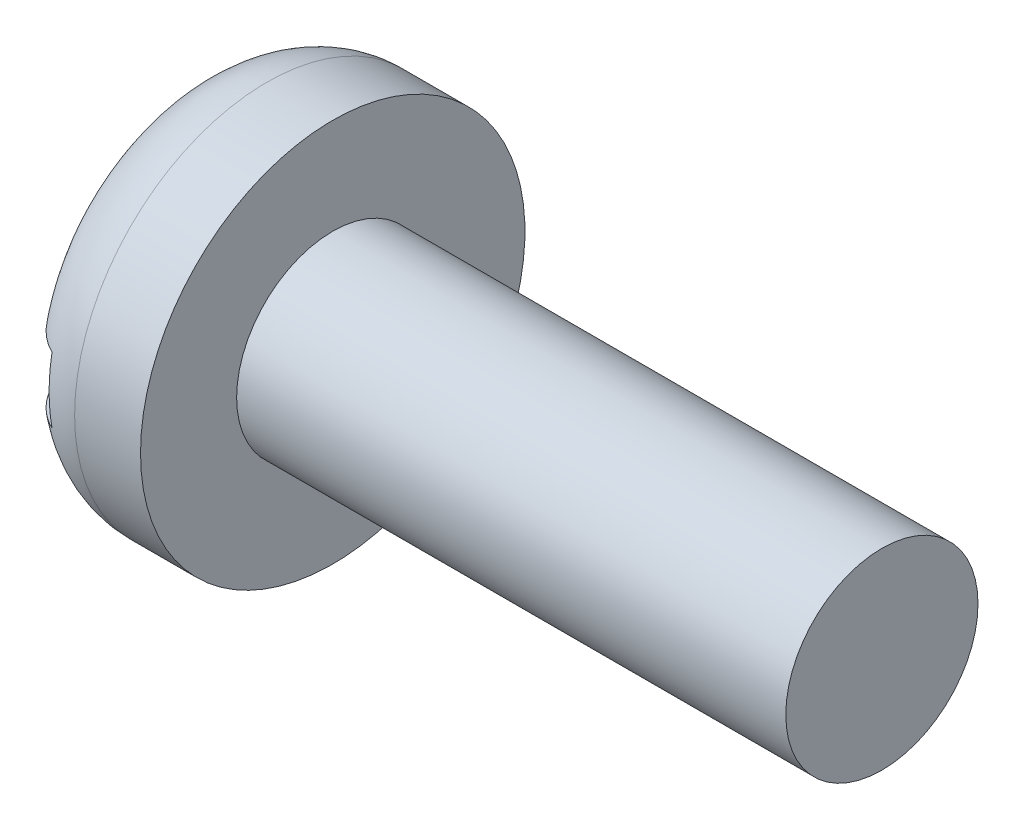
ISO-10303-21;
HEADER;
FILE_DESCRIPTION(('STEP AP214'),'2;1');
FILE_NAME('part.step','',(''),(''),'','','');
FILE_SCHEMA(('AUTOMOTIVE_DESIGN { 1 0 10303 214 1 1 1 1 }'));
ENDSEC;
DATA;
#1=APPLICATION_CONTEXT('core data for automotive mechanical design processes');
#2=APPLICATION_PROTOCOL_DEFINITION('international standard','automotive_design',2000,#1);
#3=PRODUCT_CONTEXT('',#1,'mechanical');
#4=PRODUCT('Part','Part','',(#3));
#5=PRODUCT_RELATED_PRODUCT_CATEGORY('part','',(#4));
#6=PRODUCT_DEFINITION_FORMATION('','',#4);
#7=PRODUCT_DEFINITION_CONTEXT('part definition',#1,'design');
#8=PRODUCT_DEFINITION('design','',#6,#7);
#9=PRODUCT_DEFINITION_SHAPE('','',#8);
#10=(LENGTH_UNIT() NAMED_UNIT(*) SI_UNIT(.MILLI.,.METRE.));
#11=(NAMED_UNIT(*) PLANE_ANGLE_UNIT() SI_UNIT($,.RADIAN.));
#12=(NAMED_UNIT(*) SI_UNIT($,.STERADIAN.) SOLID_ANGLE_UNIT());
#13=UNCERTAINTY_MEASURE_WITH_UNIT(LENGTH_MEASURE(1.E-05),#10,'distance_accuracy_value','');
#14=(GEOMETRIC_REPRESENTATION_CONTEXT(3) GLOBAL_UNCERTAINTY_ASSIGNED_CONTEXT((#13)) GLOBAL_UNIT_ASSIGNED_CONTEXT((#10,
#11,#12)) REPRESENTATION_CONTEXT('',''));
#15=CARTESIAN_POINT('',(0.,0.,0.));
#16=DIRECTION('',(0.,0.,1.));
#17=DIRECTION('',(1.,0.,0.));
#18=AXIS2_PLACEMENT_3D('',#15,#16,#17);
#19=CARTESIAN_POINT('',(0.,0.,0.));
#20=DIRECTION('',(-1.,0.,0.));
#21=DIRECTION('',(0.,0.,1.));
#22=AXIS2_PLACEMENT_3D('',#19,#20,#21);
#23=PLANE('',#22);
#24=DIRECTION('',(0.,0.,-1.));
#25=VECTOR('',#24,1.);
#26=CARTESIAN_POINT('',(0.,0.6,3.5));
#27=LINE('',#26,#25);
#28=CARTESIAN_POINT('',(0.,0.6,2.01246117974981));
#29=VERTEX_POINT('',#28);
#30=CARTESIAN_POINT('',(0.,0.6,-2.01246117974981));
#31=VERTEX_POINT('',#30);
#32=EDGE_CURVE('E89',#29,#31,#27,.T.);
#33=ORIENTED_EDGE('',*,*,#32,.F.);
#34=CARTESIAN_POINT('',(0.,0.,0.));
#35=DIRECTION('',(-1.,0.,0.));
#36=DIRECTION('',(0.,0.,1.));
#37=AXIS2_PLACEMENT_3D('',#34,#35,#36);
#38=CIRCLE('',#37,2.1);
#39=EDGE_CURVE('E95',#29,#31,#38,.T.);
#40=ORIENTED_EDGE('',*,*,#39,.T.);
#41=EDGE_LOOP('',(#33,#40));
#42=FACE_BOUND('',#41,.T.);
#43=ADVANCED_FACE('F32',(#42),#23,.T.);
#44=CARTESIAN_POINT('',(-25.4,0.,0.));
#45=DIRECTION('',(-1.,0.,0.));
#46=DIRECTION('',(0.,0.,1.));
#47=AXIS2_PLACEMENT_3D('',#44,#45,#46);
#48=CYLINDRICAL_SURFACE('',#47,1.75);
#49=CARTESIAN_POINT('',(12.6,0.,0.));
#50=DIRECTION('',(-1.,0.,0.));
#51=DIRECTION('',(0.,0.,1.));
#52=AXIS2_PLACEMENT_3D('',#49,#50,#51);
#53=CIRCLE('',#52,1.75);
#54=CARTESIAN_POINT('',(12.6,0.,1.75));
#55=VERTEX_POINT('',#54);
#56=EDGE_CURVE('E99',#55,#55,#53,.T.);
#57=ORIENTED_EDGE('',*,*,#56,.T.);
#58=EDGE_LOOP('',(#57));
#59=FACE_BOUND('',#58,.T.);
#60=CARTESIAN_POINT('',(2.6,0.,0.));
#61=DIRECTION('',(-1.,0.,0.));
#62=DIRECTION('',(0.,0.,1.));
#63=AXIS2_PLACEMENT_3D('',#60,#61,#62);
#64=CIRCLE('',#63,1.75);
#65=CARTESIAN_POINT('',(2.6,0.,1.75));
#66=VERTEX_POINT('',#65);
#67=EDGE_CURVE('E131',#66,#66,#64,.T.);
#68=ORIENTED_EDGE('',*,*,#67,.F.);
#69=EDGE_LOOP('',(#68));
#70=FACE_BOUND('',#69,.T.);
#71=ADVANCED_FACE('F34',(#59,#70),#48,.T.);
#72=CARTESIAN_POINT('',(12.6,1.75,0.));
#73=DIRECTION('',(1.,0.,0.));
#74=DIRECTION('',(0.,0.,-1.));
#75=AXIS2_PLACEMENT_3D('',#72,#73,#74);
#76=PLANE('',#75);
#77=ORIENTED_EDGE('',*,*,#56,.F.);
#78=EDGE_LOOP('',(#77));
#79=FACE_BOUND('',#78,.T.);
#80=ADVANCED_FACE('F150',(#79),#76,.T.);
#81=DIRECTION('',(0.,0.,1.));
#82=VECTOR('',#81,1.);
#83=CARTESIAN_POINT('',(0.,-0.599999999999999,-3.5));
#84=LINE('',#83,#82);
#85=CARTESIAN_POINT('',(0.,-0.6,-2.01246117974981));
#86=VERTEX_POINT('',#85);
#87=CARTESIAN_POINT('',(0.,-0.6,2.01246117974981));
#88=VERTEX_POINT('',#87);
#89=EDGE_CURVE('E77',#86,#88,#84,.T.);
#90=ORIENTED_EDGE('',*,*,#89,.F.);
#91=EDGE_CURVE('E88',#86,#88,#38,.T.);
#92=ORIENTED_EDGE('',*,*,#91,.T.);
#93=EDGE_LOOP('',(#90,#92));
#94=FACE_BOUND('',#93,.T.);
#95=ADVANCED_FACE('F87',(#94),#23,.T.);
#96=CARTESIAN_POINT('',(1.4,0.,0.));
#97=DIRECTION('',(-1.,0.,0.));
#98=DIRECTION('',(0.,0.,1.));
#99=AXIS2_PLACEMENT_3D('',#96,#97,#98);
#100=TOROIDAL_SURFACE('',#99,2.1,1.4);
#101=CARTESIAN_POINT('',(0.914666699250739,0.6,0.508998817025885));
#102=CARTESIAN_POINT('',(0.944641074711143,0.6,0.491877578551244));
#103=CARTESIAN_POINT('',(0.975173207236562,0.6,0.475728032405482));
#104=CARTESIAN_POINT('',(1.03736956090902,0.6,0.4457933185056));
#105=CARTESIAN_POINT('',(1.06903425348396,0.6,0.432009149511792));
#106=CARTESIAN_POINT('',(1.16536967494104,0.6,0.395334304252107));
#107=CARTESIAN_POINT('',(1.231932055284,0.6,0.376784363085214));
#108=CARTESIAN_POINT('',(1.34407503581416,0.6,0.361405174273592));
#109=CARTESIAN_POINT('',(1.38890447171577,0.6,0.359266433408296));
#110=CARTESIAN_POINT('',(1.47819822478556,0.6,0.363403856517032));
#111=CARTESIAN_POINT('',(1.52266209314118,0.6,0.369689151075489));
#112=CARTESIAN_POINT('',(1.62546456332476,0.6,0.392661846448842));
#113=CARTESIAN_POINT('',(1.68311981264789,0.6,0.412251675885863));
#114=CARTESIAN_POINT('',(1.79504803277997,0.6,0.459746641046055));
#115=CARTESIAN_POINT('',(1.84930014067224,0.6,0.487697957344709));
#116=CARTESIAN_POINT('',(1.94679894467275,0.6,0.544970042963876));
#117=CARTESIAN_POINT('',(1.9905071217791,0.6,0.573517435906191));
#118=CARTESIAN_POINT('',(2.07539237977061,0.6,0.634171088344367));
#119=CARTESIAN_POINT('',(2.11656798122757,0.6,0.666279397857739));
#120=CARTESIAN_POINT('',(2.23597579102522,0.6,0.76725303085976));
#121=CARTESIAN_POINT('',(2.31027226772078,0.6,0.840878043126341));
#122=CARTESIAN_POINT('',(2.44745590879552,0.6,1.00085329124975));
#123=CARTESIAN_POINT('',(2.51006643195071,0.6,1.08744111570907));
#124=CARTESIAN_POINT('',(2.61888048834927,0.6,1.27040958829428));
#125=CARTESIAN_POINT('',(2.66509652681533,0.6,1.36678270000725));
#126=CARTESIAN_POINT('',(2.73644637141496,0.6,1.56150334582935));
#127=CARTESIAN_POINT('',(2.76253744524381,0.6,1.6594978698399));
#128=CARTESIAN_POINT('',(2.79552846356425,0.6,1.85870563371524));
#129=CARTESIAN_POINT('',(2.80243675529983,0.6,1.9599174541993));
#130=CARTESIAN_POINT('',(2.79639834747212,0.6,2.14999629123667));
#131=CARTESIAN_POINT('',(2.78565684374396,0.6,2.23893645683675));
#132=CARTESIAN_POINT('',(2.74828561950895,0.6,2.41340917750227));
#133=CARTESIAN_POINT('',(2.72166450491561,0.6,2.49894355156263));
#134=CARTESIAN_POINT('',(2.65544421407902,0.6,2.6580616812087));
#135=CARTESIAN_POINT('',(2.61684420144075,0.6,2.73206243156425));
#136=CARTESIAN_POINT('',(2.52732611025668,0.6,2.87219905187987));
#137=CARTESIAN_POINT('',(2.4764107584513,0.6,2.93833665799134));
#138=CARTESIAN_POINT('',(2.36574598515785,0.6,3.05839762663258));
#139=CARTESIAN_POINT('',(2.30637957770412,0.6,3.11267439152247));
#140=CARTESIAN_POINT('',(2.17922152390705,0.6,3.21024976618055));
#141=CARTESIAN_POINT('',(2.11143091896154,0.6,3.25354973089105));
#142=CARTESIAN_POINT('',(1.97079403523999,0.6,3.32708995191812));
#143=CARTESIAN_POINT('',(1.89807257259707,0.6,3.35756907642437));
#144=CARTESIAN_POINT('',(1.74851327538209,0.6,3.40574887608384));
#145=CARTESIAN_POINT('',(1.67167570539061,0.6,3.42345037151811));
#146=CARTESIAN_POINT('',(1.51687578125187,0.6,3.44542653660177));
#147=CARTESIAN_POINT('',(1.43893185993874,0.6,3.44983124052595));
#148=CARTESIAN_POINT('',(1.28341661200205,0.6,3.44545148472276));
#149=CARTESIAN_POINT('',(1.20584527541961,0.6,3.43666737951224));
#150=CARTESIAN_POINT('',(1.05350425108664,0.6,3.40621783009574));
#151=CARTESIAN_POINT('',(0.978727254911519,0.6,3.38458891601016));
#152=CARTESIAN_POINT('',(0.833848948835433,0.6,3.32912442574796));
#153=CARTESIAN_POINT('',(0.763747647790526,0.6,3.2952888264519));
#154=CARTESIAN_POINT('',(0.629941119350635,0.6,3.2162782980827));
#155=CARTESIAN_POINT('',(0.56625817005794,0.6,3.17106565751997));
#156=CARTESIAN_POINT('',(0.447292946236955,0.6,3.07069013844049));
#157=CARTESIAN_POINT('',(0.392010928051826,0.6,3.01552695640857));
#158=CARTESIAN_POINT('',(0.290780144511581,0.6,2.89623966869857));
#159=CARTESIAN_POINT('',(0.244932711591271,0.6,2.83202961498993));
#160=CARTESIAN_POINT('',(0.16443682214568,0.6,2.69694464969941));
#161=CARTESIAN_POINT('',(0.129788983870994,0.6,2.62606937045615));
#162=CARTESIAN_POINT('',(0.0718999694828459,0.6,2.47821685072614));
#163=CARTESIAN_POINT('',(0.0488936092074606,0.6,2.40114777902763));
#164=CARTESIAN_POINT('',(0.0156965220812325,0.6,2.24430517158046));
#165=CARTESIAN_POINT('',(0.00550765987833356,0.6,2.16453124407131));
#166=CARTESIAN_POINT('',(-0.00222343722098575,0.6,2.00169379092137));
#167=CARTESIAN_POINT('',(0.000670886563196492,0.6,1.91860981643466));
#168=CARTESIAN_POINT('',(0.0196019987801015,0.6,1.75398516804022));
#169=CARTESIAN_POINT('',(0.0356388200439596,0.6,1.67244449798834));
#170=CARTESIAN_POINT('',(0.0812096431168178,0.6,1.50827186025987));
#171=CARTESIAN_POINT('',(0.111454220145761,0.6,1.42583796156272));
#172=CARTESIAN_POINT('',(0.184209870220441,0.6,1.26652644964546));
#173=CARTESIAN_POINT('',(0.226733363249139,0.6,1.18965456128456));
#174=CARTESIAN_POINT('',(0.32696752450761,0.6,1.03585414480852));
#175=CARTESIAN_POINT('',(0.385740767553799,0.6,0.959621349099009));
#176=CARTESIAN_POINT('',(0.513769618712281,0.6,0.816804848190425));
#177=CARTESIAN_POINT('',(0.583005194602655,0.6,0.750203169245025));
#178=CARTESIAN_POINT('',(0.69697439811481,0.6,0.655523864779723));
#179=CARTESIAN_POINT('',(0.738614923589319,0.6,0.623653391127444));
#180=CARTESIAN_POINT('',(0.824621443660588,0.6,0.563427635763789));
#181=CARTESIAN_POINT('',(0.868996664313602,0.6,0.535085350849979));
#182=CARTESIAN_POINT('',(0.914666699250739,0.6,0.508998817025885));
#183=B_SPLINE_CURVE_WITH_KNOTS('',3,(#101,#102,#103,#104,#105,#106,#107,#108,#109,#110,#111,
#112,#113,#114,#115,#116,#117,#118,#119,#120,#121,#122,#123,#124,#125,#126,#127,#128,#129,#130,
#131,#132,#133,#134,#135,#136,#137,#138,#139,#140,#141,#142,#143,#144,#145,#146,#147,#148,#149,
#150,#151,#152,#153,#154,#155,#156,#157,#158,#159,#160,#161,#162,#163,#164,#165,#166,#167,#168,
#169,#170,#171,#172,#173,#174,#175,#176,#177,#178,#179,#180,#181,#182),.UNSPECIFIED.,.T.,.F.,(4,
2,2,2,2,2,2,2,2,2,2,2,2,2,2,2,2,2,2,2,2,2,2,2,2,2,2,2,2,2,2,2,2,2,2,2,2,2,2,2,4),(0.,
0.10352213739255,0.207087879138703,0.412302817267743,0.546168973978003,0.680180341998292,
0.861806035982813,1.04445397608308,1.20086706521467,1.35737067334153,1.66974232624923,
1.98876568000329,2.3075451663717,2.61002244287269,2.91236807801016,3.1797248520632,
3.44693686428642,3.69608220882628,3.94517244048573,4.18531533303875,4.4254285686459,
4.66084547281268,4.89624726265721,5.12933938952825,5.36242525096556,5.59485137883371,
5.8272779469187,6.0604853287977,6.29369982525936,6.52930161777791,6.7649164139887,
7.00511112651804,7.24534077775385,7.49364447316491,7.74194878886272,8.00426483406255,
8.26684714398011,8.55450697403189,8.84162284193947,8.9987900640021,9.15652011037889),.UNSPECIFIED.);
#184=CARTESIAN_POINT('',(0.8,0.6,3.31098572468727));
#185=VERTEX_POINT('',#184);
#186=EDGE_CURVE('E11',#185,#29,#183,.T.);
#187=ORIENTED_EDGE('',*,*,#186,.F.);
#188=CARTESIAN_POINT('',(0.8,0.,0.));
#189=DIRECTION('',(1.,0.,0.));
#190=DIRECTION('',(0.,0.,-1.));
#191=AXIS2_PLACEMENT_3D('',#188,#189,#190);
#192=CIRCLE('',#191,3.36491106406735);
#193=CARTESIAN_POINT('',(0.8,-0.6,3.31098572468727));
#194=VERTEX_POINT('',#193);
#195=EDGE_CURVE('E107',#194,#185,#192,.F.);
#196=ORIENTED_EDGE('',*,*,#195,.F.);
#197=CARTESIAN_POINT('',(0.91466669925074,-0.6,0.508998817025885));
#198=CARTESIAN_POINT('',(0.871674715671893,-0.6,0.533563360952033));
#199=CARTESIAN_POINT('',(0.829833037317907,-0.6,0.560114977847327));
#200=CARTESIAN_POINT('',(0.748418503431565,-0.6,0.616510206729616));
#201=CARTESIAN_POINT('',(0.708847016286594,-0.6,0.646355773150688));
#202=CARTESIAN_POINT('',(0.59365211224975,-0.6,0.740282803369205));
#203=CARTESIAN_POINT('',(0.521542195375587,-0.6,0.808758176279195));
#204=CARTESIAN_POINT('',(0.384243026538762,-0.6,0.960679423467248));
#205=CARTESIAN_POINT('',(0.319808602805291,-0.6,1.04480919125148));
#206=CARTESIAN_POINT('',(0.206607685161222,-0.6,1.22300999765133));
#207=CARTESIAN_POINT('',(0.157824993281418,-0.6,1.31707062392414));
#208=CARTESIAN_POINT('',(0.0799468540560528,-0.6,1.50960148998642));
#209=CARTESIAN_POINT('',(0.0502755486334131,-0.6,1.60783692804549));
#210=CARTESIAN_POINT('',(0.0103064146578671,-0.6,1.80822313648321));
#211=CARTESIAN_POINT('',(1.53760989532992E-06,-0.6,1.91037246856604));
#212=CARTESIAN_POINT('',(-1.35366442215364E-06,-0.6,2.10251514345181));
#213=CARTESIAN_POINT('',(0.00799890009851904,-0.6,2.19251155684351));
#214=CARTESIAN_POINT('',(0.0401922171314005,-0.6,2.36955491662826));
#215=CARTESIAN_POINT('',(0.0643759893946246,-0.6,2.45660352525667));
#216=CARTESIAN_POINT('',(0.126153246953285,-0.6,2.61869652872902));
#217=CARTESIAN_POINT('',(0.162665676744717,-0.6,2.69415424614165));
#218=CARTESIAN_POINT('',(0.248319735472924,-0.6,2.8375283577095));
#219=CARTESIAN_POINT('',(0.297458358232203,-0.6,2.90544654145206));
#220=CARTESIAN_POINT('',(0.404890701182179,-0.6,3.02913474497749));
#221=CARTESIAN_POINT('',(0.462767544717965,-0.6,3.08526724939972));
#222=CARTESIAN_POINT('',(0.587295611717124,-0.6,3.18676909453746));
#223=CARTESIAN_POINT('',(0.653945705046742,-0.6,3.23213981943525));
#224=CARTESIAN_POINT('',(0.79262862093382,-0.6,3.30988448549364));
#225=CARTESIAN_POINT('',(0.864522156548722,-0.6,3.34250706986876));
#226=CARTESIAN_POINT('',(1.01280374218818,-0.6,3.39507368228662));
#227=CARTESIAN_POINT('',(1.08919148328359,-0.6,3.41501858067639));
#228=CARTESIAN_POINT('',(1.24343004467369,-0.6,3.44148055031287));
#229=CARTESIAN_POINT('',(1.32125708909559,-0.6,3.44813638000762));
#230=CARTESIAN_POINT('',(1.47691883636257,-0.6,3.44823887676783));
#231=CARTESIAN_POINT('',(1.55475353891583,-0.6,3.44168593153013));
#232=CARTESIAN_POINT('',(1.70794736122524,-0.6,3.41561288227396));
#233=CARTESIAN_POINT('',(1.78331394300334,-0.6,3.39613657380361));
#234=CARTESIAN_POINT('',(1.92972043437181,-0.6,3.34484155891086));
#235=CARTESIAN_POINT('',(2.00076034532856,-0.6,3.31302285638624));
#236=CARTESIAN_POINT('',(2.13672848627617,-0.6,3.23787863997916));
#237=CARTESIAN_POINT('',(2.20163886732156,-0.6,3.19452084458643));
#238=CARTESIAN_POINT('',(2.32334403782772,-0.6,3.09761885002823));
#239=CARTESIAN_POINT('',(2.38013861730228,-0.6,3.04407438737902));
#240=CARTESIAN_POINT('',(2.48461221568459,-0.6,2.927797649155));
#241=CARTESIAN_POINT('',(2.53219867608433,-0.6,2.86498225322417));
#242=CARTESIAN_POINT('',(2.61636816733155,-0.6,2.73237441384577));
#243=CARTESIAN_POINT('',(2.65295048022712,-0.6,2.66258151555538));
#244=CARTESIAN_POINT('',(2.71485034432407,-0.6,2.51664202448789));
#245=CARTESIAN_POINT('',(2.73994654925181,-0.6,2.44040164718866));
#246=CARTESIAN_POINT('',(2.77740926517739,-0.6,2.28486760750492));
#247=CARTESIAN_POINT('',(2.7897747809598,-0.6,2.20557370691532));
#248=CARTESIAN_POINT('',(2.80194004511146,-0.6,2.04348136186855));
#249=CARTESIAN_POINT('',(2.80132463803599,-0.6,1.96065201471139));
#250=CARTESIAN_POINT('',(2.78693001764118,-0.6,1.79615465494551));
#251=CARTESIAN_POINT('',(2.77314741955679,-0.6,1.71448694642674));
#252=CARTESIAN_POINT('',(2.73215444236967,-0.6,1.54988473830732));
#253=CARTESIAN_POINT('',(2.70425501905803,-0.6,1.46712260128615));
#254=CARTESIAN_POINT('',(2.63609665746397,-0.6,1.30690539424048));
#255=CARTESIAN_POINT('',(2.59583765982798,-0.6,1.22945034970407));
#256=CARTESIAN_POINT('',(2.50042130791695,-0.6,1.07451282675259));
#257=CARTESIAN_POINT('',(2.4442465809728,-0.6,0.997660044440374));
#258=CARTESIAN_POINT('',(2.32108616749012,-0.6,0.85297574907803));
#259=CARTESIAN_POINT('',(2.25408435412948,-0.6,0.785157972822536));
#260=CARTESIAN_POINT('',(2.15049903748616,-0.6,0.694387888538687));
#261=CARTESIAN_POINT('',(2.11746849889524,-0.6,0.667284748145142));
#262=CARTESIAN_POINT('',(2.04967785901293,-0.6,0.615343461890892));
#263=CARTESIAN_POINT('',(2.01491841675822,-0.6,0.590504463040925));
#264=CARTESIAN_POINT('',(1.94372481296411,-0.6,0.543385818891044));
#265=CARTESIAN_POINT('',(1.90729151990874,-0.6,0.52110486687527));
#266=CARTESIAN_POINT('',(1.83273534537569,-0.6,0.47961481147777));
#267=CARTESIAN_POINT('',(1.79461370978468,-0.6,0.460403489603794));
#268=CARTESIAN_POINT('',(1.71222602562119,-0.6,0.423982309771654));
#269=CARTESIAN_POINT('',(1.66774916488433,-0.6,0.407235392460801));
#270=CARTESIAN_POINT('',(1.57689750278953,-0.6,0.380640807453995));
#271=CARTESIAN_POINT('',(1.53053263007329,-0.6,0.370761008061561));
#272=CARTESIAN_POINT('',(1.43610625053428,-0.6,0.359938235983699));
#273=CARTESIAN_POINT('',(1.38803091801376,-0.6,0.359106214788348));
#274=CARTESIAN_POINT('',(1.29260361005113,-0.6,0.366933530704619));
#275=CARTESIAN_POINT('',(1.24525384035187,-0.6,0.375617551218103));
#276=CARTESIAN_POINT('',(1.14908584710659,-0.6,0.401287484533708));
#277=CARTESIAN_POINT('',(1.10043355037227,-0.6,0.418859069829152));
#278=CARTESIAN_POINT('',(1.00565509825769,-0.6,0.459890433447327));
#279=CARTESIAN_POINT('',(0.959534462380005,-0.6,0.483362499589274));
#280=CARTESIAN_POINT('',(0.91466669925074,-0.6,0.508998817025885));
#281=B_SPLINE_CURVE_WITH_KNOTS('',3,(#197,#198,#199,#200,#201,#202,#203,#204,#205,#206,#207,
#208,#209,#210,#211,#212,#213,#214,#215,#216,#217,#218,#219,#220,#221,#222,#223,#224,#225,#226,
#227,#228,#229,#230,#231,#232,#233,#234,#235,#236,#237,#238,#239,#240,#241,#242,#243,#244,#245,
#246,#247,#248,#249,#250,#251,#252,#253,#254,#255,#256,#257,#258,#259,#260,#261,#262,#263,#264,
#265,#266,#267,#268,#269,#270,#271,#272,#273,#274,#275,#276,#277,#278,#279,#280),.UNSPECIFIED.,
.T.,.F.,(4,2,2,2,2,2,2,2,2,2,2,2,2,2,2,2,2,2,2,2,2,2,2,2,2,2,2,2,2,2,2,2,2,2,2,2,2,2,2,2,2,4),
(0.,0.148481710695409,0.297052000130967,0.594171691530747,0.910610008337086,1.22671977900736,
1.53279374917873,1.83875630082027,2.10838610410516,2.3778612447566,2.62809084130807,
2.87826091566738,3.11896284704426,3.35963380248141,3.59534341079456,3.83103683545047,
4.0642561098582,4.29746853903937,4.52989465156202,4.76232069068382,4.99540392230956,
5.22849318358084,5.46381587481368,5.69915391605429,5.93885369056614,6.1785722020686,
6.42596867987271,6.67342877066256,6.93433742619765,7.19524733469705,7.47972858062345,
7.76463753148596,7.8927479643271,8.02080993181655,8.14880618813507,8.27670951605956,
8.41889313250573,8.56040690074674,8.70365410126648,8.84727374821561,9.00190911465304,
9.15686921814051),.UNSPECIFIED.);
#282=EDGE_CURVE('E44',#88,#194,#281,.T.);
#283=ORIENTED_EDGE('',*,*,#282,.F.);
#284=ORIENTED_EDGE('',*,*,#91,.F.);
#285=CARTESIAN_POINT('',(0.420644441470153,-0.6,-3.04182082778939));
#286=CARTESIAN_POINT('',(0.36383951951353,-0.6,-2.9851351518625));
#287=CARTESIAN_POINT('',(0.31184770723048,-0.6,-2.92350683231629));
#288=CARTESIAN_POINT('',(0.218984148918867,-0.6,-2.79227337535335));
#289=CARTESIAN_POINT('',(0.178132312395675,-0.6,-2.72265426805001));
#290=CARTESIAN_POINT('',(0.108696028433611,-0.6,-2.57769415205712));
#291=CARTESIAN_POINT('',(0.080090472223403,-0.6,-2.502363254777));
#292=CARTESIAN_POINT('',(0.0356397132401221,-0.6,-2.34807892268757));
#293=CARTESIAN_POINT('',(0.0197892848039347,-0.6,-2.26912698541347));
#294=CARTESIAN_POINT('',(0.000748833350116136,-0.6,-2.10787544525486));
#295=CARTESIAN_POINT('',(-0.00214108622393123,-0.6,-2.02554062298938));
#296=CARTESIAN_POINT('',(0.00525368362738522,-0.6,-1.86145316814747));
#297=CARTESIAN_POINT('',(0.0155447429885702,-0.6,-1.77970083627405));
#298=CARTESIAN_POINT('',(0.049442197865709,-0.6,-1.61466031302799));
#299=CARTESIAN_POINT('',(0.0737018518769041,-0.6,-1.53150695438829));
#300=CARTESIAN_POINT('',(0.134737044590277,-0.6,-1.37004002491137));
#301=CARTESIAN_POINT('',(0.171504203854611,-0.6,-1.29172325518563));
#302=CARTESIAN_POINT('',(0.259603957148223,-0.6,-1.13501135604287));
#303=CARTESIAN_POINT('',(0.311899152537113,-0.6,-1.05715996585639));
#304=CARTESIAN_POINT('',(0.427615472187137,-0.6,-0.909797408910719));
#305=CARTESIAN_POINT('',(0.491075282921966,-0.6,-0.840316705796539));
#306=CARTESIAN_POINT('',(0.597527474260781,-0.6,-0.739211923946335));
#307=CARTESIAN_POINT('',(0.637423466840587,-0.6,-0.704262198500875));
#308=CARTESIAN_POINT('',(0.719922222069283,-0.6,-0.637728382013758));
#309=CARTESIAN_POINT('',(0.762523869512528,-0.6,-0.606142918492091));
#310=CARTESIAN_POINT('',(0.850229003094168,-0.6,-0.546876996189483));
#311=CARTESIAN_POINT('',(0.895326424863085,-0.6,-0.519187604926647));
#312=CARTESIAN_POINT('',(0.988095950078972,-0.6,-0.468616162528639));
#313=CARTESIAN_POINT('',(1.03576355126276,-0.6,-0.445726027623499));
#314=CARTESIAN_POINT('',(1.12862312171858,-0.6,-0.408676637892538));
#315=CARTESIAN_POINT('',(1.17353954930428,-0.6,-0.393847905493966));
#316=CARTESIAN_POINT('',(1.26502546924879,-0.6,-0.371750293079272));
#317=CARTESIAN_POINT('',(1.31158330500607,-0.6,-0.364436180068864));
#318=CARTESIAN_POINT('',(1.40567964966894,-0.6,-0.359044994830761));
#319=CARTESIAN_POINT('',(1.45322315823391,-0.6,-0.361048392205836));
#320=CARTESIAN_POINT('',(1.54722879720988,-0.6,-0.373912664674515));
#321=CARTESIAN_POINT('',(1.59368485884881,-0.6,-0.384814755375942));
#322=CARTESIAN_POINT('',(1.6723498240815,-0.6,-0.409424514500809));
#323=CARTESIAN_POINT('',(1.70506374636703,-0.6,-0.421616419370322));
#324=CARTESIAN_POINT('',(1.76932584790636,-0.6,-0.44878129444247));
#325=CARTESIAN_POINT('',(1.80087332448533,-0.6,-0.463755909266368));
#326=CARTESIAN_POINT('',(1.893947148114,-0.6,-0.512057531988728));
#327=CARTESIAN_POINT('',(1.95375417371958,-0.6,-0.548709458875773));
#328=CARTESIAN_POINT('',(2.05609651041606,-0.6,-0.619666282329036));
#329=CARTESIAN_POINT('',(2.0995331856163,-0.6,-0.652707862946048));
#330=CARTESIAN_POINT('',(2.18351470537008,-0.6,-0.722307797822654));
#331=CARTESIAN_POINT('',(2.22405834831834,-0.6,-0.75886759871926));
#332=CARTESIAN_POINT('',(2.34082259929183,-0.6,-0.873292475226468));
#333=CARTESIAN_POINT('',(2.41238048443941,-0.6,-0.956045749037178));
#334=CARTESIAN_POINT('',(2.53978756482013,-0.6,-1.13264272975461));
#335=CARTESIAN_POINT('',(2.59566890211492,-0.6,-1.22646317554397));
#336=CARTESIAN_POINT('',(2.68872718626666,-0.6,-1.42302998495435));
#337=CARTESIAN_POINT('',(2.72591558833936,-0.6,-1.52577083667637));
#338=CARTESIAN_POINT('',(2.77612211426008,-0.6,-1.7256175836042));
#339=CARTESIAN_POINT('',(2.79125933743458,-0.6,-1.82219094381709));
#340=CARTESIAN_POINT('',(2.80306809100473,-0.6,-2.01647408989372));
#341=CARTESIAN_POINT('',(2.7997508883117,-0.6,-2.11418314602688));
#342=CARTESIAN_POINT('',(2.77551296623721,-0.6,-2.29699817945257));
#343=CARTESIAN_POINT('',(2.75646543246013,-0.6,-2.38235528298148));
#344=CARTESIAN_POINT('',(2.70344256054702,-0.6,-2.54829965456378));
#345=CARTESIAN_POINT('',(2.66947347801378,-0.6,-2.6288889054096));
#346=CARTESIAN_POINT('',(2.58981077958682,-0.6,-2.77818789901273));
#347=CARTESIAN_POINT('',(2.54489300712671,-0.6,-2.84731244955202));
#348=CARTESIAN_POINT('',(2.4437496037465,-0.6,-2.97672708769377));
#349=CARTESIAN_POINT('',(2.38752609479799,-0.599999999999999,-3.03701882945931));
#350=CARTESIAN_POINT('',(2.26726125359489,-0.599999999999999,-3.14515699280837));
#351=CARTESIAN_POINT('',(2.20351025555185,-0.599999999999999,-3.19332658949782));
#352=CARTESIAN_POINT('',(2.06871532371722,-0.599999999999999,-3.27806679058193));
#353=CARTESIAN_POINT('',(1.99767211706221,-0.599999999999999,-3.31463854996105));
#354=CARTESIAN_POINT('',(1.8515791840513,-0.599999999999999,-3.37454993783909));
#355=CARTESIAN_POINT('',(1.77661463190327,-0.599999999999999,-3.39809741904048));
#356=CARTESIAN_POINT('',(1.62378584466932,-0.599999999999999,-3.43216139643063));
#357=CARTESIAN_POINT('',(1.54592192631416,-0.599999999999999,-3.4426793117104));
#358=CARTESIAN_POINT('',(1.39015773810542,-0.599999999999999,-3.45033819179447));
#359=CARTESIAN_POINT('',(1.31226259748697,-0.599999999999999,-3.44758399614396));
#360=CARTESIAN_POINT('',(1.15801674298814,-0.599999999999999,-3.42901701268982));
#361=CARTESIAN_POINT('',(1.08166652809874,-0.599999999999999,-3.41320007264525));
#362=CARTESIAN_POINT('',(0.932752163145591,-0.599999999999999,-3.36899599905637));
#363=CARTESIAN_POINT('',(0.860186083354315,-0.599999999999999,-3.34061534388));
#364=CARTESIAN_POINT('',(0.720902274888949,-0.599999999999999,-3.27215091234341));
#365=CARTESIAN_POINT('',(0.654175510903174,-0.599999999999999,-3.23208564754686));
#366=CARTESIAN_POINT('',(0.560965637094945,-0.599999999999999,-3.16497351404718));
#367=CARTESIAN_POINT('',(0.5315306353739,-0.599999999999999,-3.14192365197248));
#368=CARTESIAN_POINT('',(0.474597304727746,-0.599999999999999,-3.09354676001557));
#369=CARTESIAN_POINT('',(0.447098930686806,-0.6,-3.06821978321251));
#370=CARTESIAN_POINT('',(0.420644441470153,-0.6,-3.04182082778939));
#371=B_SPLINE_CURVE_WITH_KNOTS('',3,(#285,#286,#287,#288,#289,#290,#291,#292,#293,#294,#295,
#296,#297,#298,#299,#300,#301,#302,#303,#304,#305,#306,#307,#308,#309,#310,#311,#312,#313,#314,
#315,#316,#317,#318,#319,#320,#321,#322,#323,#324,#325,#326,#327,#328,#329,#330,#331,#332,#333,
#334,#335,#336,#337,#338,#339,#340,#341,#342,#343,#344,#345,#346,#347,#348,#349,#350,#351,#352,
#353,#354,#355,#356,#357,#358,#359,#360,#361,#362,#363,#364,#365,#366,#367,#368,#369,#370),
.UNSPECIFIED.,.T.,.F.,(4,2,2,2,2,2,2,2,2,2,2,2,2,2,2,2,2,2,2,2,2,2,2,2,2,2,2,2,2,2,2,2,2,2,2,2,
2,2,2,2,2,2,4),(0.,0.240607999396509,0.481643239346924,0.722261320293895,0.962780771880245,
1.20884167732283,1.45502154082905,1.71377551320769,1.9723564729342,2.25261307510564,
2.53386063990886,2.69283405041762,2.8517423559101,3.010280181129,3.16854878420985,
3.3099919419336,3.45057862771619,3.59238171773865,3.73484534170327,3.83944524490313,
3.94410716589426,4.15390528962519,4.31746099657062,4.48108424477518,4.80759287622261,
5.13342708186289,5.45906136889865,5.75067855065451,6.04211771201365,6.30314300064038,
6.56405896318611,6.81014991773804,7.05619472656391,7.29474416820232,7.53326984614489,
7.76787017922027,8.00244495898832,8.23516982855615,8.46796870262107,8.70064767558821,
8.93296000660468,9.04501561450045,9.15706861107593),.UNSPECIFIED.);
#372=CARTESIAN_POINT('',(0.8,-0.599999999999999,-3.31098572468727));
#373=VERTEX_POINT('',#372);
#374=EDGE_CURVE('E74',#373,#86,#371,.T.);
#375=ORIENTED_EDGE('',*,*,#374,.F.);
#376=CARTESIAN_POINT('',(0.8,0.6,-3.31098572468727));
#377=VERTEX_POINT('',#376);
#378=EDGE_CURVE('E83',#377,#373,#192,.F.);
#379=ORIENTED_EDGE('',*,*,#378,.F.);
#380=CARTESIAN_POINT('',(0.420644441470153,0.6,-3.04182082778939));
#381=CARTESIAN_POINT('',(0.475995009013937,0.6,-3.09704906003999));
#382=CARTESIAN_POINT('',(0.53597548233346,0.6,-3.14764811531429));
#383=CARTESIAN_POINT('',(0.663577010452333,0.6,-3.23809226875413));
#384=CARTESIAN_POINT('',(0.731199296473588,0.6,-3.27793563048588));
#385=CARTESIAN_POINT('',(0.872212432371448,0.6,-3.34567763268423));
#386=CARTESIAN_POINT('',(0.945605015769056,0.6,-3.37357266726351));
#387=CARTESIAN_POINT('',(1.09604808966239,0.6,-3.41655600899114));
#388=CARTESIAN_POINT('',(1.17309842293438,0.6,-3.4316448660714));
#389=CARTESIAN_POINT('',(1.32815944015941,0.6,-3.44850776693575));
#390=CARTESIAN_POINT('',(1.40616124543108,0.6,-3.45036352669219));
#391=CARTESIAN_POINT('',(1.56136315244771,0.6,-3.44092091093598));
#392=CARTESIAN_POINT('',(1.63856327110425,0.6,-3.42962281347514));
#393=CARTESIAN_POINT('',(1.78979628669556,0.6,-3.3942514614967));
#394=CARTESIAN_POINT('',(1.86383582318304,0.6,-3.3702065726286));
#395=CARTESIAN_POINT('',(2.00684909132748,0.6,-3.31007504365753));
#396=CARTESIAN_POINT('',(2.07582279779123,0.6,-3.2739883436736));
#397=CARTESIAN_POINT('',(2.20705803692911,0.6,-3.19067265050502));
#398=CARTESIAN_POINT('',(2.26929184017089,0.6,-3.14339999862989));
#399=CARTESIAN_POINT('',(2.38504383858389,0.6,-3.03918111725781));
#400=CARTESIAN_POINT('',(2.43856175678707,0.6,-2.98223458046753));
#401=CARTESIAN_POINT('',(2.53602509135335,0.6,-2.85964241719308));
#402=CARTESIAN_POINT('',(2.57985886244567,0.6,-2.79390807987281));
#403=CARTESIAN_POINT('',(2.65611761945784,0.6,-2.65613262145406));
#404=CARTESIAN_POINT('',(2.68854183929415,0.6,-2.58409107726953));
#405=CARTESIAN_POINT('',(2.74183153780012,0.6,-2.4341873611522));
#406=CARTESIAN_POINT('',(2.76244580469363,0.6,-2.35623600156808));
#407=CARTESIAN_POINT('',(2.790769441403,0.6,-2.19803478263831));
#408=CARTESIAN_POINT('',(2.79847739809598,0.6,-2.1177846725788));
#409=CARTESIAN_POINT('',(2.80115957280824,0.6,-1.95424782857532));
#410=CARTESIAN_POINT('',(2.79567482698107,0.6,-1.87095387257338));
#411=CARTESIAN_POINT('',(2.77159976585095,0.6,-1.70630006334618));
#412=CARTESIAN_POINT('',(2.75300694467676,0.6,-1.62494058300944));
#413=CARTESIAN_POINT('',(2.7022173085098,0.6,-1.46126159645388));
#414=CARTESIAN_POINT('',(2.66927530787037,0.6,-1.37917420642698));
#415=CARTESIAN_POINT('',(2.59128328876964,0.6,-1.22099442215514));
#416=CARTESIAN_POINT('',(2.54622931576653,0.6,-1.14490399642199));
#417=CARTESIAN_POINT('',(2.44072900245642,0.6,-0.992811917172515));
#418=CARTESIAN_POINT('',(2.37920121126619,0.6,-0.917562898281443));
#419=CARTESIAN_POINT('',(2.24568305705541,0.6,-0.776933826576547));
#420=CARTESIAN_POINT('',(2.17368447228038,0.6,-0.71156161212332));
#421=CARTESIAN_POINT('',(2.04026692884319,0.6,-0.607405958892293));
#422=CARTESIAN_POINT('',(1.98082536904444,0.6,-0.56609153356594));
#423=CARTESIAN_POINT('',(1.88806150076154,0.6,-0.510106632355433));
#424=CARTESIAN_POINT('',(1.85654075267558,0.6,-0.49244313858386));
#425=CARTESIAN_POINT('',(1.79226651483096,0.6,-0.459542336226475));
#426=CARTESIAN_POINT('',(1.75951359665874,0.6,-0.44430391942935));
#427=CARTESIAN_POINT('',(1.68300604947086,0.6,-0.412869016581017));
#428=CARTESIAN_POINT('',(1.6388209104091,0.6,-0.397681620596737));
#429=CARTESIAN_POINT('',(1.5487304495883,0.6,-0.374450105956365));
#430=CARTESIAN_POINT('',(1.5028343153353,0.6,-0.366372334944208));
#431=CARTESIAN_POINT('',(1.40984322271282,0.6,-0.359131567479815));
#432=CARTESIAN_POINT('',(1.36274102047716,0.6,-0.360053911782687));
#433=CARTESIAN_POINT('',(1.26947929004802,0.6,-0.370776363695776));
#434=CARTESIAN_POINT('',(1.22332370432059,0.6,-0.380607992187687));
#435=CARTESIAN_POINT('',(1.11363287337693,0.6,-0.412639693964483));
#436=CARTESIAN_POINT('',(1.05116901031389,0.6,-0.438342162232175));
#437=CARTESIAN_POINT('',(0.930426566795515,0.6,-0.498311166694412));
#438=CARTESIAN_POINT('',(0.872166230059407,0.6,-0.532612444038762));
#439=CARTESIAN_POINT('',(0.770881587962037,0.6,-0.600127327436463));
#440=CARTESIAN_POINT('',(0.727111197365938,0.6,-0.632233074466714));
#441=CARTESIAN_POINT('',(0.642396931006956,0.6,-0.699989212261819));
#442=CARTESIAN_POINT('',(0.601454348706128,0.6,-0.735641207152333));
#443=CARTESIAN_POINT('',(0.483343612886224,0.6,-0.847359979809582));
#444=CARTESIAN_POINT('',(0.410688069727505,0.6,-0.928327664163129));
#445=CARTESIAN_POINT('',(0.280329268102497,0.6,-1.10173446315036));
#446=CARTESIAN_POINT('',(0.222648370255392,0.6,-1.19419043153282));
#447=CARTESIAN_POINT('',(0.125568321223717,0.6,-1.38830913699468));
#448=CARTESIAN_POINT('',(0.0861570697414543,0.6,-1.48996572685801));
#449=CARTESIAN_POINT('',(0.031131080361826,0.6,-1.68912944632696));
#450=CARTESIAN_POINT('',(0.0136053153843455,0.6,-1.78610768375734));
#451=CARTESIAN_POINT('',(-0.00279930245463031,0.6,-1.98165438694302));
#452=CARTESIAN_POINT('',(-0.0016877793006486,0.6,-2.08022200569845));
#453=CARTESIAN_POINT('',(0.0186231791926501,0.6,-2.26477006739658));
#454=CARTESIAN_POINT('',(0.0358731309083345,0.6,-2.35096820976731));
#455=CARTESIAN_POINT('',(0.0855167956388033,0.6,-2.51886633472376));
#456=CARTESIAN_POINT('',(0.117899020694547,0.6,-2.60056967712245));
#457=CARTESIAN_POINT('',(0.191360950288965,0.6,-2.74561279174633));
#458=CARTESIAN_POINT('',(0.230556792340137,0.6,-2.80991383926524));
#459=CARTESIAN_POINT('',(0.318628566603381,0.6,-2.93150499442174));
#460=CARTESIAN_POINT('',(0.367502619690557,0.6,-2.98879645955429));
#461=CARTESIAN_POINT('',(0.420644441470153,0.6,-3.04182082778939));
#462=B_SPLINE_CURVE_WITH_KNOTS('',3,(#380,#381,#382,#383,#384,#385,#386,#387,#388,#389,#390,
#391,#392,#393,#394,#395,#396,#397,#398,#399,#400,#401,#402,#403,#404,#405,#406,#407,#408,#409,
#410,#411,#412,#413,#414,#415,#416,#417,#418,#419,#420,#421,#422,#423,#424,#425,#426,#427,#428,
#429,#430,#431,#432,#433,#434,#435,#436,#437,#438,#439,#440,#441,#442,#443,#444,#445,#446,#447,
#448,#449,#450,#451,#452,#453,#454,#455,#456,#457,#458,#459,#460,#461),.UNSPECIFIED.,.T.,.F.,(4,
2,2,2,2,2,2,2,2,2,2,2,2,2,2,2,2,2,2,2,2,2,2,2,2,2,2,2,2,2,2,2,2,2,2,2,2,2,2,2,4),(0.,
0.234309983008167,0.468657771182034,0.703076233462547,0.937484628670382,1.1704442602617,
1.4033989675429,1.63583743955672,1.86827706744707,2.1016393210444,2.33500898883761,
2.57094294584728,2.80689274139821,3.04769106394259,3.28851574997629,3.53783897307634,
3.78720987223499,4.05145274396363,4.31578199561728,4.60624640137999,4.89694012612694,
5.11357933539807,5.22189376451047,5.33015855309023,5.469893938241,5.60896429345116,
5.74935461128196,5.89024357500206,6.09178082244501,6.29414583301566,6.45679290087068,
6.61951387873283,6.94422444643018,7.26941712914072,7.59439412239067,7.88837773778469,
8.18220954962385,8.44457969296712,8.70675097570932,8.93175454173885,9.15671446375501),.UNSPECIFIED.);
#463=EDGE_CURVE('E82',#31,#377,#462,.T.);
#464=ORIENTED_EDGE('',*,*,#463,.F.);
#465=ORIENTED_EDGE('',*,*,#39,.F.);
#466=EDGE_LOOP('',(#187,#196,#283,#284,#375,#379,#464,#465));
#467=FACE_BOUND('',#466,.T.);
#468=CARTESIAN_POINT('',(1.4,0.,0.));
#469=DIRECTION('',(-1.,0.,0.));
#470=DIRECTION('',(0.,0.,1.));
#471=AXIS2_PLACEMENT_3D('',#468,#469,#470);
#472=CIRCLE('',#471,3.5);
#473=CARTESIAN_POINT('',(1.4,0.,3.5));
#474=VERTEX_POINT('',#473);
#475=EDGE_CURVE('E96',#474,#474,#472,.T.);
#476=ORIENTED_EDGE('',*,*,#475,.T.);
#477=EDGE_LOOP('',(#476));
#478=FACE_BOUND('',#477,.T.);
#479=ADVANCED_FACE('F92',(#467,#478),#100,.T.);
#480=CARTESIAN_POINT('',(-25.4,0.,0.));
#481=DIRECTION('',(-1.,0.,0.));
#482=DIRECTION('',(0.,0.,1.));
#483=AXIS2_PLACEMENT_3D('',#480,#481,#482);
#484=CYLINDRICAL_SURFACE('',#483,3.5);
#485=CARTESIAN_POINT('',(2.6,0.,0.));
#486=DIRECTION('',(-1.,0.,0.));
#487=DIRECTION('',(0.,0.,1.));
#488=AXIS2_PLACEMENT_3D('',#485,#486,#487);
#489=CIRCLE('',#488,3.5);
#490=CARTESIAN_POINT('',(2.6,0.,3.5));
#491=VERTEX_POINT('',#490);
#492=EDGE_CURVE('E101',#491,#491,#489,.T.);
#493=ORIENTED_EDGE('',*,*,#492,.T.);
#494=EDGE_LOOP('',(#493));
#495=FACE_BOUND('',#494,.T.);
#496=ORIENTED_EDGE('',*,*,#475,.F.);
#497=EDGE_LOOP('',(#496));
#498=FACE_BOUND('',#497,.T.);
#499=ADVANCED_FACE('F141',(#495,#498),#484,.T.);
#500=CARTESIAN_POINT('',(2.6,1.75,0.));
#501=DIRECTION('',(-1.,0.,0.));
#502=DIRECTION('',(0.,0.,1.));
#503=AXIS2_PLACEMENT_3D('',#500,#501,#502);
#504=PLANE('',#503);
#505=ORIENTED_EDGE('',*,*,#492,.F.);
#506=EDGE_LOOP('',(#505));
#507=FACE_BOUND('',#506,.T.);
#508=ORIENTED_EDGE('',*,*,#67,.T.);
#509=EDGE_LOOP('',(#508));
#510=FACE_BOUND('',#509,.T.);
#511=ADVANCED_FACE('F144',(#507,#510),#504,.F.);
#512=CARTESIAN_POINT('',(0.8,0.6,3.5));
#513=DIRECTION('',(0.,1.,0.));
#514=DIRECTION('',(0.,0.,1.));
#515=AXIS2_PLACEMENT_3D('',#512,#513,#514);
#516=PLANE('',#515);
#517=ORIENTED_EDGE('',*,*,#463,.T.);
#518=DIRECTION('',(0.,0.,-1.));
#519=VECTOR('',#518,1.);
#520=CARTESIAN_POINT('',(0.8,0.6,3.5));
#521=LINE('',#520,#519);
#522=EDGE_CURVE('E51',#185,#377,#521,.T.);
#523=ORIENTED_EDGE('',*,*,#522,.F.);
#524=ORIENTED_EDGE('',*,*,#186,.T.);
#525=ORIENTED_EDGE('',*,*,#32,.T.);
#526=EDGE_LOOP('',(#517,#523,#524,#525));
#527=FACE_BOUND('',#526,.T.);
#528=ADVANCED_FACE('F121',(#527),#516,.F.);
#529=CARTESIAN_POINT('',(0.8,-0.599999999999999,-3.5));
#530=DIRECTION('',(0.,-1.,0.));
#531=DIRECTION('',(0.,0.,-1.));
#532=AXIS2_PLACEMENT_3D('',#529,#530,#531);
#533=PLANE('',#532);
#534=ORIENTED_EDGE('',*,*,#374,.T.);
#535=ORIENTED_EDGE('',*,*,#89,.T.);
#536=ORIENTED_EDGE('',*,*,#282,.T.);
#537=DIRECTION('',(0.,0.,1.));
#538=VECTOR('',#537,1.);
#539=CARTESIAN_POINT('',(0.8,-0.599999999999999,-3.5));
#540=LINE('',#539,#538);
#541=EDGE_CURVE('E78',#373,#194,#540,.T.);
#542=ORIENTED_EDGE('',*,*,#541,.F.);
#543=EDGE_LOOP('',(#534,#535,#536,#542));
#544=FACE_BOUND('',#543,.T.);
#545=ADVANCED_FACE('F76',(#544),#533,.F.);
#546=CARTESIAN_POINT('',(0.8,-0.599999999999999,-3.5));
#547=DIRECTION('',(1.,0.,0.));
#548=DIRECTION('',(0.,0.,-1.));
#549=AXIS2_PLACEMENT_3D('',#546,#547,#548);
#550=PLANE('',#549);
#551=ORIENTED_EDGE('',*,*,#195,.T.);
#552=ORIENTED_EDGE('',*,*,#522,.T.);
#553=ORIENTED_EDGE('',*,*,#378,.T.);
#554=ORIENTED_EDGE('',*,*,#541,.T.);
#555=EDGE_LOOP('',(#551,#552,#553,#554));
#556=FACE_BOUND('',#555,.T.);
#557=ADVANCED_FACE('F120',(#556),#550,.F.);
#558=CLOSED_SHELL('',(#43,#71,#80,#95,#479,#499,#511,#528,#545,#557));
#559=MANIFOLD_SOLID_BREP('B2',#558);
#560=ADVANCED_BREP_SHAPE_REPRESENTATION('',(#18,#559),#14);
#561=SHAPE_DEFINITION_REPRESENTATION(#9,#560);
ENDSEC;
END-ISO-10303-21;
